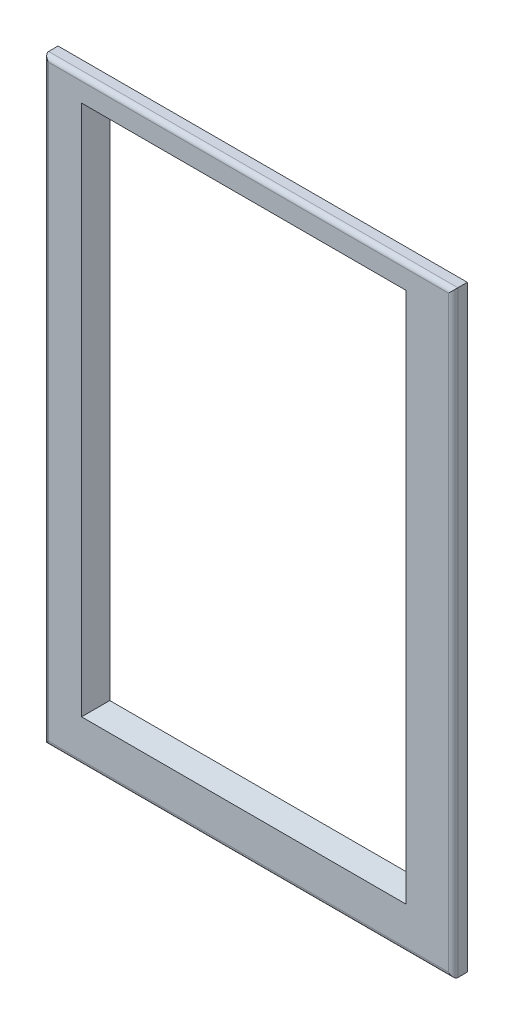
ISO-10303-21;
HEADER;
FILE_DESCRIPTION(('STEP AP214'),'2;1');
FILE_NAME('part.step','',(''),(''),'','','');
FILE_SCHEMA(('AUTOMOTIVE_DESIGN { 1 0 10303 214 1 1 1 1 }'));
ENDSEC;
DATA;
#1=APPLICATION_CONTEXT('core data for automotive mechanical design processes');
#2=APPLICATION_PROTOCOL_DEFINITION('international standard','automotive_design',2000,#1);
#3=PRODUCT_CONTEXT('',#1,'mechanical');
#4=PRODUCT('Part','Part','',(#3));
#5=PRODUCT_RELATED_PRODUCT_CATEGORY('part','',(#4));
#6=PRODUCT_DEFINITION_FORMATION('','',#4);
#7=PRODUCT_DEFINITION_CONTEXT('part definition',#1,'design');
#8=PRODUCT_DEFINITION('design','',#6,#7);
#9=PRODUCT_DEFINITION_SHAPE('','',#8);
#10=(LENGTH_UNIT() NAMED_UNIT(*) SI_UNIT(.MILLI.,.METRE.));
#11=(NAMED_UNIT(*) PLANE_ANGLE_UNIT() SI_UNIT($,.RADIAN.));
#12=(NAMED_UNIT(*) SI_UNIT($,.STERADIAN.) SOLID_ANGLE_UNIT());
#13=UNCERTAINTY_MEASURE_WITH_UNIT(LENGTH_MEASURE(1.E-05),#10,'distance_accuracy_value','');
#14=(GEOMETRIC_REPRESENTATION_CONTEXT(3) GLOBAL_UNCERTAINTY_ASSIGNED_CONTEXT((#13)) GLOBAL_UNIT_ASSIGNED_CONTEXT((#10,
#11,#12)) REPRESENTATION_CONTEXT('',''));
#15=CARTESIAN_POINT('',(0.,0.,0.));
#16=DIRECTION('',(0.,0.,1.));
#17=DIRECTION('',(1.,0.,0.));
#18=AXIS2_PLACEMENT_3D('',#15,#16,#17);
#19=CARTESIAN_POINT('',(0.,-170.998578163398,3.));
#20=DIRECTION('',(0.,1.,0.));
#21=DIRECTION('',(0.,0.,1.));
#22=AXIS2_PLACEMENT_3D('',#19,#20,#21);
#23=PLANE('',#22);
#24=DIRECTION('',(0.,0.,-1.));
#25=VECTOR('',#24,1.);
#26=CARTESIAN_POINT('',(148.090301410676,-170.998578163398,3.));
#27=LINE('',#26,#25);
#28=CARTESIAN_POINT('',(148.090301410676,-170.998578163398,2.));
#29=VERTEX_POINT('',#28);
#30=CARTESIAN_POINT('',(148.090301410676,-170.998578163398,0.));
#31=VERTEX_POINT('',#30);
#32=EDGE_CURVE('E184',#29,#31,#27,.T.);
#33=ORIENTED_EDGE('',*,*,#32,.F.);
#34=DIRECTION('',(1.,0.,0.));
#35=VECTOR('',#34,1.);
#36=CARTESIAN_POINT('',(0.,-170.998578163398,2.));
#37=LINE('',#36,#35);
#38=CARTESIAN_POINT('',(235.090301410676,-170.998578163398,2.));
#39=VERTEX_POINT('',#38);
#40=EDGE_CURVE('E46',#29,#39,#37,.T.);
#41=ORIENTED_EDGE('',*,*,#40,.T.);
#42=DIRECTION('',(0.,0.,-1.));
#43=VECTOR('',#42,1.);
#44=CARTESIAN_POINT('',(235.090301410676,-170.998578163398,3.));
#45=LINE('',#44,#43);
#46=CARTESIAN_POINT('',(235.090301410676,-170.998578163398,0.));
#47=VERTEX_POINT('',#46);
#48=EDGE_CURVE('E190',#39,#47,#45,.T.);
#49=ORIENTED_EDGE('',*,*,#48,.T.);
#50=DIRECTION('',(1.,0.,0.));
#51=VECTOR('',#50,1.);
#52=CARTESIAN_POINT('',(0.,-170.998578163398,0.));
#53=LINE('',#52,#51);
#54=EDGE_CURVE('E201',#31,#47,#53,.T.);
#55=ORIENTED_EDGE('',*,*,#54,.F.);
#56=EDGE_LOOP('',(#33,#41,#49,#55));
#57=FACE_BOUND('',#56,.T.);
#58=ADVANCED_FACE('F37',(#57),#23,.T.);
#59=CARTESIAN_POINT('',(148.090301410676,0.,3.));
#60=DIRECTION('',(1.,0.,0.));
#61=DIRECTION('',(0.,0.,-1.));
#62=AXIS2_PLACEMENT_3D('',#59,#60,#61);
#63=PLANE('',#62);
#64=DIRECTION('',(0.,0.,-1.));
#65=VECTOR('',#64,1.);
#66=CARTESIAN_POINT('',(148.090301410676,-297.998578163397,3.));
#67=LINE('',#66,#65);
#68=CARTESIAN_POINT('',(148.090301410676,-297.998578163397,2.));
#69=VERTEX_POINT('',#68);
#70=CARTESIAN_POINT('',(148.090301410676,-297.998578163397,0.));
#71=VERTEX_POINT('',#70);
#72=EDGE_CURVE('E186',#69,#71,#67,.T.);
#73=ORIENTED_EDGE('',*,*,#72,.F.);
#74=DIRECTION('',(0.,-1.,0.));
#75=VECTOR('',#74,1.);
#76=CARTESIAN_POINT('',(148.090301410676,-170.998578163398,2.));
#77=LINE('',#76,#75);
#78=EDGE_CURVE('E11',#69,#29,#77,.F.);
#79=ORIENTED_EDGE('',*,*,#78,.T.);
#80=ORIENTED_EDGE('',*,*,#32,.T.);
#81=DIRECTION('',(0.,-1.,0.));
#82=VECTOR('',#81,1.);
#83=CARTESIAN_POINT('',(148.090301410676,0.,0.));
#84=LINE('',#83,#82);
#85=EDGE_CURVE('E198',#31,#71,#84,.T.);
#86=ORIENTED_EDGE('',*,*,#85,.T.);
#87=EDGE_LOOP('',(#73,#79,#80,#86));
#88=FACE_BOUND('',#87,.T.);
#89=ADVANCED_FACE('F223',(#88),#63,.F.);
#90=CARTESIAN_POINT('',(0.,-297.998578163397,3.));
#91=DIRECTION('',(0.,1.,0.));
#92=DIRECTION('',(0.,0.,1.));
#93=AXIS2_PLACEMENT_3D('',#90,#91,#92);
#94=PLANE('',#93);
#95=DIRECTION('',(0.,0.,-1.));
#96=VECTOR('',#95,1.);
#97=CARTESIAN_POINT('',(235.090301410676,-297.998578163397,3.));
#98=LINE('',#97,#96);
#99=CARTESIAN_POINT('',(235.090301410676,-297.998578163397,2.));
#100=VERTEX_POINT('',#99);
#101=CARTESIAN_POINT('',(235.090301410676,-297.998578163397,0.));
#102=VERTEX_POINT('',#101);
#103=EDGE_CURVE('E188',#100,#102,#98,.T.);
#104=ORIENTED_EDGE('',*,*,#103,.F.);
#105=DIRECTION('',(1.,0.,0.));
#106=VECTOR('',#105,1.);
#107=CARTESIAN_POINT('',(148.090301410676,-297.998578163397,2.));
#108=LINE('',#107,#106);
#109=EDGE_CURVE('E155',#100,#69,#108,.F.);
#110=ORIENTED_EDGE('',*,*,#109,.T.);
#111=ORIENTED_EDGE('',*,*,#72,.T.);
#112=DIRECTION('',(1.,0.,0.));
#113=VECTOR('',#112,1.);
#114=CARTESIAN_POINT('',(0.,-297.998578163397,0.));
#115=LINE('',#114,#113);
#116=EDGE_CURVE('E195',#71,#102,#115,.T.);
#117=ORIENTED_EDGE('',*,*,#116,.T.);
#118=EDGE_LOOP('',(#104,#110,#111,#117));
#119=FACE_BOUND('',#118,.T.);
#120=ADVANCED_FACE('F227',(#119),#94,.F.);
#121=CARTESIAN_POINT('',(235.090301410676,0.,3.));
#122=DIRECTION('',(1.,0.,0.));
#123=DIRECTION('',(0.,0.,-1.));
#124=AXIS2_PLACEMENT_3D('',#121,#122,#123);
#125=PLANE('',#124);
#126=ORIENTED_EDGE('',*,*,#48,.F.);
#127=DIRECTION('',(0.,-1.,0.));
#128=VECTOR('',#127,1.);
#129=CARTESIAN_POINT('',(235.090301410676,0.,2.));
#130=LINE('',#129,#128);
#131=EDGE_CURVE('E158',#39,#100,#130,.T.);
#132=ORIENTED_EDGE('',*,*,#131,.T.);
#133=ORIENTED_EDGE('',*,*,#103,.T.);
#134=DIRECTION('',(0.,-1.,0.));
#135=VECTOR('',#134,1.);
#136=CARTESIAN_POINT('',(235.090301410676,0.,0.));
#137=LINE('',#136,#135);
#138=EDGE_CURVE('E192',#47,#102,#137,.T.);
#139=ORIENTED_EDGE('',*,*,#138,.F.);
#140=EDGE_LOOP('',(#126,#132,#133,#139));
#141=FACE_BOUND('',#140,.T.);
#142=ADVANCED_FACE('F232',(#141),#125,.T.);
#143=CARTESIAN_POINT('',(0.,0.,3.));
#144=DIRECTION('',(0.,0.,1.));
#145=DIRECTION('',(1.,0.,0.));
#146=AXIS2_PLACEMENT_3D('',#143,#144,#145);
#147=PLANE('',#146);
#148=DIRECTION('',(0.,-1.,0.));
#149=VECTOR('',#148,1.);
#150=CARTESIAN_POINT('',(149.090301410676,-297.998578163397,3.));
#151=LINE('',#150,#149);
#152=CARTESIAN_POINT('',(149.090301410676,-171.998578163398,3.));
#153=VERTEX_POINT('',#152);
#154=CARTESIAN_POINT('',(149.090301410676,-296.998578163397,3.));
#155=VERTEX_POINT('',#154);
#156=EDGE_CURVE('E145',#153,#155,#151,.T.);
#157=ORIENTED_EDGE('',*,*,#156,.T.);
#158=DIRECTION('',(1.,0.,0.));
#159=VECTOR('',#158,1.);
#160=CARTESIAN_POINT('',(235.090301410676,-296.998578163397,3.));
#161=LINE('',#160,#159);
#162=CARTESIAN_POINT('',(234.090301410676,-296.998578163397,3.));
#163=VERTEX_POINT('',#162);
#164=EDGE_CURVE('E152',#155,#163,#161,.T.);
#165=ORIENTED_EDGE('',*,*,#164,.T.);
#166=DIRECTION('',(0.,-1.,0.));
#167=VECTOR('',#166,1.);
#168=CARTESIAN_POINT('',(234.090301410676,0.,3.));
#169=LINE('',#168,#167);
#170=CARTESIAN_POINT('',(234.090301410676,-171.998578163398,3.));
#171=VERTEX_POINT('',#170);
#172=EDGE_CURVE('E150',#163,#171,#169,.F.);
#173=ORIENTED_EDGE('',*,*,#172,.T.);
#174=DIRECTION('',(1.,0.,0.));
#175=VECTOR('',#174,1.);
#176=CARTESIAN_POINT('',(0.,-171.998578163398,3.));
#177=LINE('',#176,#175);
#178=EDGE_CURVE('E147',#171,#153,#177,.F.);
#179=ORIENTED_EDGE('',*,*,#178,.T.);
#180=EDGE_LOOP('',(#157,#165,#173,#179));
#181=FACE_BOUND('',#180,.T.);
#182=DIRECTION('',(0.,-1.,0.));
#183=VECTOR('',#182,1.);
#184=CARTESIAN_POINT('',(225.090301410676,-285.998578163397,3.));
#185=LINE('',#184,#183);
#186=CARTESIAN_POINT('',(225.090301410676,-175.998578163398,3.));
#187=VERTEX_POINT('',#186);
#188=CARTESIAN_POINT('',(225.090301410676,-288.998578163397,3.));
#189=VERTEX_POINT('',#188);
#190=EDGE_CURVE('E137',#187,#189,#185,.T.);
#191=ORIENTED_EDGE('',*,*,#190,.T.);
#192=DIRECTION('',(-1.,0.,0.));
#193=VECTOR('',#192,1.);
#194=CARTESIAN_POINT('',(0.,-288.998578163397,3.));
#195=LINE('',#194,#193);
#196=CARTESIAN_POINT('',(156.090301410676,-288.998578163397,3.));
#197=VERTEX_POINT('',#196);
#198=EDGE_CURVE('E148',#189,#197,#195,.T.);
#199=ORIENTED_EDGE('',*,*,#198,.T.);
#200=DIRECTION('',(0.,1.,0.));
#201=VECTOR('',#200,1.);
#202=CARTESIAN_POINT('',(156.090301410676,0.,3.));
#203=LINE('',#202,#201);
#204=CARTESIAN_POINT('',(156.090301410676,-175.998578163398,3.));
#205=VERTEX_POINT('',#204);
#206=EDGE_CURVE('E179',#197,#205,#203,.T.);
#207=ORIENTED_EDGE('',*,*,#206,.T.);
#208=DIRECTION('',(1.,0.,0.));
#209=VECTOR('',#208,1.);
#210=CARTESIAN_POINT('',(222.090301410676,-175.998578163398,3.));
#211=LINE('',#210,#209);
#212=EDGE_CURVE('E181',#205,#187,#211,.T.);
#213=ORIENTED_EDGE('',*,*,#212,.T.);
#214=EDGE_LOOP('',(#191,#199,#207,#213));
#215=FACE_BOUND('',#214,.T.);
#216=ADVANCED_FACE('F236',(#181,#215),#147,.T.);
#217=CARTESIAN_POINT('',(0.,0.,0.));
#218=DIRECTION('',(0.,0.,1.));
#219=DIRECTION('',(1.,0.,0.));
#220=AXIS2_PLACEMENT_3D('',#217,#218,#219);
#221=PLANE('',#220);
#222=DIRECTION('',(1.,0.,0.));
#223=VECTOR('',#222,1.);
#224=CARTESIAN_POINT('',(0.,-178.998578163398,0.));
#225=LINE('',#224,#223);
#226=CARTESIAN_POINT('',(159.090301410676,-178.998578163398,0.));
#227=VERTEX_POINT('',#226);
#228=CARTESIAN_POINT('',(222.090301410676,-178.998578163398,0.));
#229=VERTEX_POINT('',#228);
#230=EDGE_CURVE('E118',#227,#229,#225,.T.);
#231=ORIENTED_EDGE('',*,*,#230,.F.);
#232=DIRECTION('',(0.,-1.,0.));
#233=VECTOR('',#232,1.);
#234=CARTESIAN_POINT('',(159.090301410676,0.,0.));
#235=LINE('',#234,#233);
#236=CARTESIAN_POINT('',(159.090301410676,-285.998578163397,0.));
#237=VERTEX_POINT('',#236);
#238=EDGE_CURVE('E204',#227,#237,#235,.T.);
#239=ORIENTED_EDGE('',*,*,#238,.T.);
#240=DIRECTION('',(1.,0.,0.));
#241=VECTOR('',#240,1.);
#242=CARTESIAN_POINT('',(0.,-285.998578163397,0.));
#243=LINE('',#242,#241);
#244=CARTESIAN_POINT('',(222.090301410676,-285.998578163397,0.));
#245=VERTEX_POINT('',#244);
#246=EDGE_CURVE('E121',#237,#245,#243,.T.);
#247=ORIENTED_EDGE('',*,*,#246,.T.);
#248=DIRECTION('',(0.,-1.,0.));
#249=VECTOR('',#248,1.);
#250=CARTESIAN_POINT('',(222.090301410676,0.,0.));
#251=LINE('',#250,#249);
#252=EDGE_CURVE('E114',#229,#245,#251,.T.);
#253=ORIENTED_EDGE('',*,*,#252,.F.);
#254=EDGE_LOOP('',(#231,#239,#247,#253));
#255=FACE_BOUND('',#254,.T.);
#256=ORIENTED_EDGE('',*,*,#54,.T.);
#257=ORIENTED_EDGE('',*,*,#138,.T.);
#258=ORIENTED_EDGE('',*,*,#116,.F.);
#259=ORIENTED_EDGE('',*,*,#85,.F.);
#260=EDGE_LOOP('',(#256,#257,#258,#259));
#261=FACE_BOUND('',#260,.T.);
#262=ADVANCED_FACE('F116',(#255,#261),#221,.F.);
#263=CARTESIAN_POINT('',(0.,-175.998578163398,3.));
#264=DIRECTION('',(0.,-0.707106781186544,0.707106781186551));
#265=DIRECTION('',(-1.,0.,0.));
#266=AXIS2_PLACEMENT_3D('',#263,#264,#265);
#267=PLANE('',#266);
#268=DIRECTION('',(-0.577350269189628,-0.577350269189628,-0.577350269189622));
#269=VECTOR('',#268,1.);
#270=CARTESIAN_POINT('',(150.06020094045,-251.028678633623,-72.030100470225));
#271=LINE('',#270,#269);
#272=EDGE_CURVE('E130',#187,#229,#271,.T.);
#273=ORIENTED_EDGE('',*,*,#272,.F.);
#274=ORIENTED_EDGE('',*,*,#212,.F.);
#275=DIRECTION('',(-0.577350269189628,0.577350269189628,0.577350269189622));
#276=VECTOR('',#275,1.);
#277=CARTESIAN_POINT('',(99.4241086895428,-119.332385442265,59.6661927211324));
#278=LINE('',#277,#276);
#279=EDGE_CURVE('E133',#227,#205,#278,.T.);
#280=ORIENTED_EDGE('',*,*,#279,.F.);
#281=ORIENTED_EDGE('',*,*,#230,.T.);
#282=EDGE_LOOP('',(#273,#274,#280,#281));
#283=FACE_BOUND('',#282,.T.);
#284=ADVANCED_FACE('F128',(#283),#267,.T.);
#285=CARTESIAN_POINT('',(159.090301410676,0.,0.));
#286=DIRECTION('',(-0.707106781186544,0.,-0.707106781186551));
#287=DIRECTION('',(0.,-1.,0.));
#288=AXIS2_PLACEMENT_3D('',#285,#286,#287);
#289=PLANE('',#288);
#290=ORIENTED_EDGE('',*,*,#279,.T.);
#291=ORIENTED_EDGE('',*,*,#206,.F.);
#292=DIRECTION('',(0.577350269189629,0.577350269189624,-0.577350269189624));
#293=VECTOR('',#292,1.);
#294=CARTESIAN_POINT('',(106.06020094045,-339.028678633623,53.0301004702254));
#295=LINE('',#294,#293);
#296=EDGE_CURVE('E138',#237,#197,#295,.F.);
#297=ORIENTED_EDGE('',*,*,#296,.F.);
#298=ORIENTED_EDGE('',*,*,#238,.F.);
#299=EDGE_LOOP('',(#290,#291,#297,#298));
#300=FACE_BOUND('',#299,.T.);
#301=ADVANCED_FACE('F209',(#300),#289,.F.);
#302=CARTESIAN_POINT('',(225.090301410676,0.,3.));
#303=DIRECTION('',(-0.707106781186544,0.,0.707106781186551));
#304=DIRECTION('',(0.,1.,0.));
#305=AXIS2_PLACEMENT_3D('',#302,#303,#304);
#306=PLANE('',#305);
#307=ORIENTED_EDGE('',*,*,#272,.T.);
#308=ORIENTED_EDGE('',*,*,#252,.T.);
#309=DIRECTION('',(-0.577350269189629,0.577350269189624,-0.577350269189624));
#310=VECTOR('',#309,1.);
#311=CARTESIAN_POINT('',(148.06020094045,-211.968477693172,-74.0301004702255));
#312=LINE('',#311,#310);
#313=EDGE_CURVE('E141',#189,#245,#312,.T.);
#314=ORIENTED_EDGE('',*,*,#313,.F.);
#315=ORIENTED_EDGE('',*,*,#190,.F.);
#316=EDGE_LOOP('',(#307,#308,#314,#315));
#317=FACE_BOUND('',#316,.T.);
#318=ADVANCED_FACE('F136',(#317),#306,.T.);
#319=CARTESIAN_POINT('',(0.,-285.998578163397,0.));
#320=DIRECTION('',(0.,-0.707106781186547,-0.707106781186547));
#321=DIRECTION('',(1.,0.,0.));
#322=AXIS2_PLACEMENT_3D('',#319,#320,#321);
#323=PLANE('',#322);
#324=ORIENTED_EDGE('',*,*,#296,.T.);
#325=ORIENTED_EDGE('',*,*,#198,.F.);
#326=ORIENTED_EDGE('',*,*,#313,.T.);
#327=ORIENTED_EDGE('',*,*,#246,.F.);
#328=EDGE_LOOP('',(#324,#325,#326,#327));
#329=FACE_BOUND('',#328,.T.);
#330=ADVANCED_FACE('F210',(#329),#323,.F.);
#331=CARTESIAN_POINT('',(0.,-171.998578163398,2.));
#332=DIRECTION('',(1.,0.,0.));
#333=DIRECTION('',(0.,0.,-1.));
#334=AXIS2_PLACEMENT_3D('',#331,#332,#333);
#335=CYLINDRICAL_SURFACE('',#334,1.);
#336=CARTESIAN_POINT('',(234.090301410676,-171.998578163398,2.));
#337=DIRECTION('',(0.707106781186547,-0.707106781186547,0.));
#338=DIRECTION('',(0.707106781186547,0.707106781186547,0.));
#339=AXIS2_PLACEMENT_3D('',#336,#337,#338);
#340=ELLIPSE('',#339,1.41421356237309,1.);
#341=EDGE_CURVE('E164',#39,#171,#340,.T.);
#342=ORIENTED_EDGE('',*,*,#341,.F.);
#343=ORIENTED_EDGE('',*,*,#40,.F.);
#344=CARTESIAN_POINT('',(149.090301410676,-171.998578163398,2.));
#345=DIRECTION('',(0.707106781186547,0.707106781186547,0.));
#346=DIRECTION('',(-0.707106781186547,0.707106781186547,0.));
#347=AXIS2_PLACEMENT_3D('',#344,#345,#346);
#348=ELLIPSE('',#347,1.41421356237309,1.);
#349=EDGE_CURVE('E41',#153,#29,#348,.F.);
#350=ORIENTED_EDGE('',*,*,#349,.F.);
#351=ORIENTED_EDGE('',*,*,#178,.F.);
#352=EDGE_LOOP('',(#342,#343,#350,#351));
#353=FACE_BOUND('',#352,.T.);
#354=ADVANCED_FACE('F39',(#353),#335,.T.);
#355=CARTESIAN_POINT('',(149.090301410676,0.,2.));
#356=DIRECTION('',(0.,1.,0.));
#357=DIRECTION('',(0.,0.,1.));
#358=AXIS2_PLACEMENT_3D('',#355,#356,#357);
#359=CYLINDRICAL_SURFACE('',#358,1.);
#360=ORIENTED_EDGE('',*,*,#349,.T.);
#361=ORIENTED_EDGE('',*,*,#78,.F.);
#362=CARTESIAN_POINT('',(149.090301410676,-296.998578163397,2.));
#363=DIRECTION('',(-0.707106781186547,0.707106781186547,0.));
#364=DIRECTION('',(0.707106781186547,0.707106781186547,0.));
#365=AXIS2_PLACEMENT_3D('',#362,#363,#364);
#366=ELLIPSE('',#365,1.41421356237309,1.);
#367=EDGE_CURVE('E163',#155,#69,#366,.F.);
#368=ORIENTED_EDGE('',*,*,#367,.F.);
#369=ORIENTED_EDGE('',*,*,#156,.F.);
#370=EDGE_LOOP('',(#360,#361,#368,#369));
#371=FACE_BOUND('',#370,.T.);
#372=ADVANCED_FACE('F217',(#371),#359,.T.);
#373=CARTESIAN_POINT('',(234.090301410676,0.,2.));
#374=DIRECTION('',(0.,-1.,0.));
#375=DIRECTION('',(0.,0.,-1.));
#376=AXIS2_PLACEMENT_3D('',#373,#374,#375);
#377=CYLINDRICAL_SURFACE('',#376,1.);
#378=ORIENTED_EDGE('',*,*,#341,.T.);
#379=ORIENTED_EDGE('',*,*,#172,.F.);
#380=CARTESIAN_POINT('',(234.090301410676,-296.998578163397,2.));
#381=DIRECTION('',(-0.707106781186547,-0.707106781186547,0.));
#382=DIRECTION('',(0.707106781186547,-0.707106781186547,0.));
#383=AXIS2_PLACEMENT_3D('',#380,#381,#382);
#384=ELLIPSE('',#383,1.41421356237309,1.);
#385=EDGE_CURVE('E161',#100,#163,#384,.T.);
#386=ORIENTED_EDGE('',*,*,#385,.F.);
#387=ORIENTED_EDGE('',*,*,#131,.F.);
#388=EDGE_LOOP('',(#378,#379,#386,#387));
#389=FACE_BOUND('',#388,.T.);
#390=ADVANCED_FACE('F252',(#389),#377,.T.);
#391=CARTESIAN_POINT('',(0.,-296.998578163397,2.));
#392=DIRECTION('',(-1.,0.,0.));
#393=DIRECTION('',(0.,0.,1.));
#394=AXIS2_PLACEMENT_3D('',#391,#392,#393);
#395=CYLINDRICAL_SURFACE('',#394,1.);
#396=ORIENTED_EDGE('',*,*,#367,.T.);
#397=ORIENTED_EDGE('',*,*,#109,.F.);
#398=ORIENTED_EDGE('',*,*,#385,.T.);
#399=ORIENTED_EDGE('',*,*,#164,.F.);
#400=EDGE_LOOP('',(#396,#397,#398,#399));
#401=FACE_BOUND('',#400,.T.);
#402=ADVANCED_FACE('F250',(#401),#395,.T.);
#403=CLOSED_SHELL('',(#58,#89,#120,#142,#216,#262,#284,#301,#318,#330,#354,#372,#390,#402));
#404=MANIFOLD_SOLID_BREP('B2',#403);
#405=ADVANCED_BREP_SHAPE_REPRESENTATION('',(#18,#404),#14);
#406=SHAPE_DEFINITION_REPRESENTATION(#9,#405);
ENDSEC;
END-ISO-10303-21;
